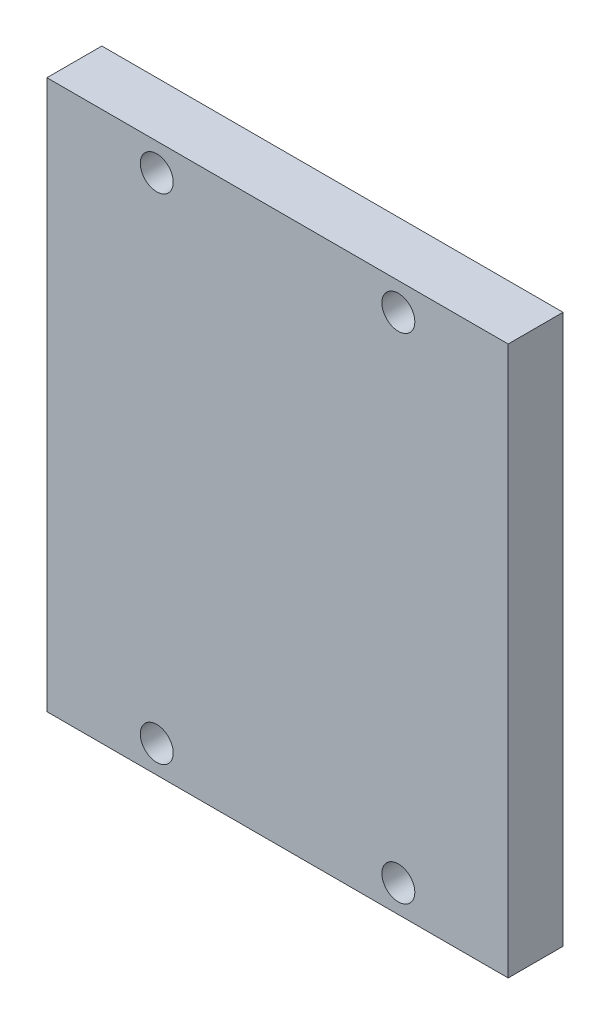
ISO-10303-21;
HEADER;
FILE_DESCRIPTION(('STEP AP214'),'2;1');
FILE_NAME('part.step','',(''),(''),'','','');
FILE_SCHEMA(('AUTOMOTIVE_DESIGN { 1 0 10303 214 1 1 1 1 }'));
ENDSEC;
DATA;
#1=APPLICATION_CONTEXT('core data for automotive mechanical design processes');
#2=APPLICATION_PROTOCOL_DEFINITION('international standard','automotive_design',2000,#1);
#3=PRODUCT_CONTEXT('',#1,'mechanical');
#4=PRODUCT('Part','Part','',(#3));
#5=PRODUCT_RELATED_PRODUCT_CATEGORY('part','',(#4));
#6=PRODUCT_DEFINITION_FORMATION('','',#4);
#7=PRODUCT_DEFINITION_CONTEXT('part definition',#1,'design');
#8=PRODUCT_DEFINITION('design','',#6,#7);
#9=PRODUCT_DEFINITION_SHAPE('','',#8);
#10=(LENGTH_UNIT() NAMED_UNIT(*) SI_UNIT(.MILLI.,.METRE.));
#11=(NAMED_UNIT(*) PLANE_ANGLE_UNIT() SI_UNIT($,.RADIAN.));
#12=(NAMED_UNIT(*) SI_UNIT($,.STERADIAN.) SOLID_ANGLE_UNIT());
#13=UNCERTAINTY_MEASURE_WITH_UNIT(LENGTH_MEASURE(1.E-05),#10,'distance_accuracy_value','');
#14=(GEOMETRIC_REPRESENTATION_CONTEXT(3) GLOBAL_UNCERTAINTY_ASSIGNED_CONTEXT((#13)) GLOBAL_UNIT_ASSIGNED_CONTEXT((#10,
#11,#12)) REPRESENTATION_CONTEXT('',''));
#15=CARTESIAN_POINT('',(0.,0.,0.));
#16=DIRECTION('',(0.,0.,1.));
#17=DIRECTION('',(1.,0.,0.));
#18=AXIS2_PLACEMENT_3D('',#15,#16,#17);
#19=CARTESIAN_POINT('',(0.,0.,5.));
#20=DIRECTION('',(0.,0.,-1.));
#21=DIRECTION('',(-1.,0.,0.));
#22=AXIS2_PLACEMENT_3D('',#19,#20,#21);
#23=PLANE('',#22);
#24=CARTESIAN_POINT('',(10.,2.5,5.));
#25=DIRECTION('',(0.,0.,1.));
#26=DIRECTION('',(1.,0.,0.));
#27=AXIS2_PLACEMENT_3D('',#24,#25,#26);
#28=CIRCLE('',#27,1.5);
#29=CARTESIAN_POINT('',(11.5,2.5,5.));
#30=VERTEX_POINT('',#29);
#31=EDGE_CURVE('E82',#30,#30,#28,.T.);
#32=ORIENTED_EDGE('',*,*,#31,.F.);
#33=EDGE_LOOP('',(#32));
#34=FACE_BOUND('',#33,.T.);
#35=DIRECTION('',(0.,-1.,0.));
#36=VECTOR('',#35,1.);
#37=CARTESIAN_POINT('',(0.,0.,5.));
#38=LINE('',#37,#36);
#39=CARTESIAN_POINT('',(0.,50.,5.));
#40=VERTEX_POINT('',#39);
#41=CARTESIAN_POINT('',(0.,0.,5.));
#42=VERTEX_POINT('',#41);
#43=EDGE_CURVE('E68',#40,#42,#38,.T.);
#44=ORIENTED_EDGE('',*,*,#43,.T.);
#45=DIRECTION('',(1.,0.,0.));
#46=VECTOR('',#45,1.);
#47=CARTESIAN_POINT('',(0.,0.,5.));
#48=LINE('',#47,#46);
#49=CARTESIAN_POINT('',(42.,0.,5.));
#50=VERTEX_POINT('',#49);
#51=EDGE_CURVE('E50',#42,#50,#48,.T.);
#52=ORIENTED_EDGE('',*,*,#51,.T.);
#53=DIRECTION('',(0.,1.,0.));
#54=VECTOR('',#53,1.);
#55=CARTESIAN_POINT('',(42.,0.,5.));
#56=LINE('',#55,#54);
#57=CARTESIAN_POINT('',(42.,50.,5.));
#58=VERTEX_POINT('',#57);
#59=EDGE_CURVE('E117',#50,#58,#56,.T.);
#60=ORIENTED_EDGE('',*,*,#59,.T.);
#61=DIRECTION('',(1.,0.,0.));
#62=VECTOR('',#61,1.);
#63=CARTESIAN_POINT('',(0.,50.,5.));
#64=LINE('',#63,#62);
#65=EDGE_CURVE('E89',#40,#58,#64,.T.);
#66=ORIENTED_EDGE('',*,*,#65,.F.);
#67=EDGE_LOOP('',(#44,#52,#60,#66));
#68=FACE_BOUND('',#67,.T.);
#69=CARTESIAN_POINT('',(32.,2.5,5.));
#70=DIRECTION('',(0.,0.,1.));
#71=DIRECTION('',(1.,0.,0.));
#72=AXIS2_PLACEMENT_3D('',#69,#70,#71);
#73=CIRCLE('',#72,1.5);
#74=CARTESIAN_POINT('',(33.5,2.5,5.));
#75=VERTEX_POINT('',#74);
#76=EDGE_CURVE('E104',#75,#75,#73,.T.);
#77=ORIENTED_EDGE('',*,*,#76,.F.);
#78=EDGE_LOOP('',(#77));
#79=FACE_BOUND('',#78,.T.);
#80=CARTESIAN_POINT('',(32.,47.5,5.));
#81=DIRECTION('',(0.,0.,-1.));
#82=DIRECTION('',(1.,0.,0.));
#83=AXIS2_PLACEMENT_3D('',#80,#81,#82);
#84=CIRCLE('',#83,1.5);
#85=CARTESIAN_POINT('',(33.5,47.5,5.));
#86=VERTEX_POINT('',#85);
#87=EDGE_CURVE('E135',#86,#86,#84,.T.);
#88=ORIENTED_EDGE('',*,*,#87,.T.);
#89=EDGE_LOOP('',(#88));
#90=FACE_BOUND('',#89,.T.);
#91=CARTESIAN_POINT('',(10.,47.5,5.));
#92=DIRECTION('',(0.,0.,-1.));
#93=DIRECTION('',(1.,0.,0.));
#94=AXIS2_PLACEMENT_3D('',#91,#92,#93);
#95=CIRCLE('',#94,1.5);
#96=CARTESIAN_POINT('',(11.5,47.5,5.));
#97=VERTEX_POINT('',#96);
#98=EDGE_CURVE('E94',#97,#97,#95,.T.);
#99=ORIENTED_EDGE('',*,*,#98,.T.);
#100=EDGE_LOOP('',(#99));
#101=FACE_BOUND('',#100,.T.);
#102=ADVANCED_FACE('F33',(#34,#68,#79,#90,#101),#23,.F.);
#103=CARTESIAN_POINT('',(0.,0.,0.));
#104=DIRECTION('',(0.,0.,-1.));
#105=DIRECTION('',(-1.,0.,0.));
#106=AXIS2_PLACEMENT_3D('',#103,#104,#105);
#107=PLANE('',#106);
#108=CARTESIAN_POINT('',(10.,2.5,0.));
#109=DIRECTION('',(0.,0.,1.));
#110=DIRECTION('',(1.,0.,0.));
#111=AXIS2_PLACEMENT_3D('',#108,#109,#110);
#112=CIRCLE('',#111,1.5);
#113=CARTESIAN_POINT('',(11.5,2.5,0.));
#114=VERTEX_POINT('',#113);
#115=EDGE_CURVE('E107',#114,#114,#112,.T.);
#116=ORIENTED_EDGE('',*,*,#115,.T.);
#117=EDGE_LOOP('',(#116));
#118=FACE_BOUND('',#117,.T.);
#119=DIRECTION('',(0.,-1.,0.));
#120=VECTOR('',#119,1.);
#121=CARTESIAN_POINT('',(0.,0.,0.));
#122=LINE('',#121,#120);
#123=CARTESIAN_POINT('',(0.,50.,0.));
#124=VERTEX_POINT('',#123);
#125=CARTESIAN_POINT('',(0.,0.,0.));
#126=VERTEX_POINT('',#125);
#127=EDGE_CURVE('E77',#124,#126,#122,.T.);
#128=ORIENTED_EDGE('',*,*,#127,.F.);
#129=DIRECTION('',(1.,0.,0.));
#130=VECTOR('',#129,1.);
#131=CARTESIAN_POINT('',(0.,50.,0.));
#132=LINE('',#131,#130);
#133=CARTESIAN_POINT('',(42.,50.,0.));
#134=VERTEX_POINT('',#133);
#135=EDGE_CURVE('E81',#124,#134,#132,.T.);
#136=ORIENTED_EDGE('',*,*,#135,.T.);
#137=DIRECTION('',(0.,1.,0.));
#138=VECTOR('',#137,1.);
#139=CARTESIAN_POINT('',(42.,0.,0.));
#140=LINE('',#139,#138);
#141=CARTESIAN_POINT('',(42.,0.,0.));
#142=VERTEX_POINT('',#141);
#143=EDGE_CURVE('E115',#142,#134,#140,.T.);
#144=ORIENTED_EDGE('',*,*,#143,.F.);
#145=DIRECTION('',(1.,0.,0.));
#146=VECTOR('',#145,1.);
#147=CARTESIAN_POINT('',(0.,0.,0.));
#148=LINE('',#147,#146);
#149=EDGE_CURVE('E61',#126,#142,#148,.T.);
#150=ORIENTED_EDGE('',*,*,#149,.F.);
#151=EDGE_LOOP('',(#128,#136,#144,#150));
#152=FACE_BOUND('',#151,.T.);
#153=CARTESIAN_POINT('',(32.,2.5,0.));
#154=DIRECTION('',(0.,0.,1.));
#155=DIRECTION('',(1.,0.,0.));
#156=AXIS2_PLACEMENT_3D('',#153,#154,#155);
#157=CIRCLE('',#156,1.5);
#158=CARTESIAN_POINT('',(33.5,2.5,0.));
#159=VERTEX_POINT('',#158);
#160=EDGE_CURVE('E103',#159,#159,#157,.T.);
#161=ORIENTED_EDGE('',*,*,#160,.T.);
#162=EDGE_LOOP('',(#161));
#163=FACE_BOUND('',#162,.T.);
#164=CARTESIAN_POINT('',(32.,47.5,0.));
#165=DIRECTION('',(0.,0.,-1.));
#166=DIRECTION('',(1.,0.,0.));
#167=AXIS2_PLACEMENT_3D('',#164,#165,#166);
#168=CIRCLE('',#167,1.5);
#169=CARTESIAN_POINT('',(33.5,47.5,0.));
#170=VERTEX_POINT('',#169);
#171=EDGE_CURVE('E146',#170,#170,#168,.T.);
#172=ORIENTED_EDGE('',*,*,#171,.F.);
#173=EDGE_LOOP('',(#172));
#174=FACE_BOUND('',#173,.T.);
#175=CARTESIAN_POINT('',(10.,47.5,0.));
#176=DIRECTION('',(0.,0.,-1.));
#177=DIRECTION('',(1.,0.,0.));
#178=AXIS2_PLACEMENT_3D('',#175,#176,#177);
#179=CIRCLE('',#178,1.5);
#180=CARTESIAN_POINT('',(11.5,47.5,0.));
#181=VERTEX_POINT('',#180);
#182=EDGE_CURVE('E98',#181,#181,#179,.T.);
#183=ORIENTED_EDGE('',*,*,#182,.F.);
#184=EDGE_LOOP('',(#183));
#185=FACE_BOUND('',#184,.T.);
#186=ADVANCED_FACE('F78',(#118,#152,#163,#174,#185),#107,.T.);
#187=CARTESIAN_POINT('',(0.,0.,5.));
#188=DIRECTION('',(1.,0.,0.));
#189=DIRECTION('',(0.,0.,-1.));
#190=AXIS2_PLACEMENT_3D('',#187,#188,#189);
#191=PLANE('',#190);
#192=ORIENTED_EDGE('',*,*,#127,.T.);
#193=DIRECTION('',(0.,0.,-1.));
#194=VECTOR('',#193,1.);
#195=CARTESIAN_POINT('',(0.,0.,5.));
#196=LINE('',#195,#194);
#197=EDGE_CURVE('E11',#42,#126,#196,.T.);
#198=ORIENTED_EDGE('',*,*,#197,.F.);
#199=ORIENTED_EDGE('',*,*,#43,.F.);
#200=DIRECTION('',(0.,0.,-1.));
#201=VECTOR('',#200,1.);
#202=CARTESIAN_POINT('',(0.,50.,5.));
#203=LINE('',#202,#201);
#204=EDGE_CURVE('E84',#40,#124,#203,.T.);
#205=ORIENTED_EDGE('',*,*,#204,.T.);
#206=EDGE_LOOP('',(#192,#198,#199,#205));
#207=FACE_BOUND('',#206,.T.);
#208=ADVANCED_FACE('F35',(#207),#191,.F.);
#209=CARTESIAN_POINT('',(0.,0.,5.));
#210=DIRECTION('',(0.,1.,0.));
#211=DIRECTION('',(0.,0.,1.));
#212=AXIS2_PLACEMENT_3D('',#209,#210,#211);
#213=PLANE('',#212);
#214=ORIENTED_EDGE('',*,*,#149,.T.);
#215=DIRECTION('',(0.,0.,-1.));
#216=VECTOR('',#215,1.);
#217=CARTESIAN_POINT('',(42.,0.,5.));
#218=LINE('',#217,#216);
#219=EDGE_CURVE('E42',#50,#142,#218,.T.);
#220=ORIENTED_EDGE('',*,*,#219,.F.);
#221=ORIENTED_EDGE('',*,*,#51,.F.);
#222=ORIENTED_EDGE('',*,*,#197,.T.);
#223=EDGE_LOOP('',(#214,#220,#221,#222));
#224=FACE_BOUND('',#223,.T.);
#225=ADVANCED_FACE('F125',(#224),#213,.F.);
#226=CARTESIAN_POINT('',(42.,0.,5.));
#227=DIRECTION('',(-1.,0.,0.));
#228=DIRECTION('',(0.,0.,1.));
#229=AXIS2_PLACEMENT_3D('',#226,#227,#228);
#230=PLANE('',#229);
#231=ORIENTED_EDGE('',*,*,#143,.T.);
#232=DIRECTION('',(0.,0.,-1.));
#233=VECTOR('',#232,1.);
#234=CARTESIAN_POINT('',(42.,50.,5.));
#235=LINE('',#234,#233);
#236=EDGE_CURVE('E88',#58,#134,#235,.T.);
#237=ORIENTED_EDGE('',*,*,#236,.F.);
#238=ORIENTED_EDGE('',*,*,#59,.F.);
#239=ORIENTED_EDGE('',*,*,#219,.T.);
#240=EDGE_LOOP('',(#231,#237,#238,#239));
#241=FACE_BOUND('',#240,.T.);
#242=ADVANCED_FACE('F123',(#241),#230,.F.);
#243=CARTESIAN_POINT('',(10.,2.5,5.));
#244=DIRECTION('',(0.,0.,-1.));
#245=DIRECTION('',(-1.,0.,0.));
#246=AXIS2_PLACEMENT_3D('',#243,#244,#245);
#247=CYLINDRICAL_SURFACE('',#246,1.5);
#248=ORIENTED_EDGE('',*,*,#31,.T.);
#249=EDGE_LOOP('',(#248));
#250=FACE_BOUND('',#249,.T.);
#251=ORIENTED_EDGE('',*,*,#115,.F.);
#252=EDGE_LOOP('',(#251));
#253=FACE_BOUND('',#252,.T.);
#254=ADVANCED_FACE('F162',(#250,#253),#247,.F.);
#255=CARTESIAN_POINT('',(32.,2.5,5.));
#256=DIRECTION('',(0.,0.,-1.));
#257=DIRECTION('',(-1.,0.,0.));
#258=AXIS2_PLACEMENT_3D('',#255,#256,#257);
#259=CYLINDRICAL_SURFACE('',#258,1.5);
#260=ORIENTED_EDGE('',*,*,#76,.T.);
#261=EDGE_LOOP('',(#260));
#262=FACE_BOUND('',#261,.T.);
#263=ORIENTED_EDGE('',*,*,#160,.F.);
#264=EDGE_LOOP('',(#263));
#265=FACE_BOUND('',#264,.T.);
#266=ADVANCED_FACE('F179',(#262,#265),#259,.F.);
#267=CARTESIAN_POINT('',(0.,50.,5.));
#268=DIRECTION('',(0.,1.,0.));
#269=DIRECTION('',(0.,0.,1.));
#270=AXIS2_PLACEMENT_3D('',#267,#268,#269);
#271=PLANE('',#270);
#272=ORIENTED_EDGE('',*,*,#135,.F.);
#273=ORIENTED_EDGE('',*,*,#204,.F.);
#274=ORIENTED_EDGE('',*,*,#65,.T.);
#275=ORIENTED_EDGE('',*,*,#236,.T.);
#276=EDGE_LOOP('',(#272,#273,#274,#275));
#277=FACE_BOUND('',#276,.T.);
#278=ADVANCED_FACE('F92',(#277),#271,.T.);
#279=CARTESIAN_POINT('',(10.,47.5,5.));
#280=DIRECTION('',(0.,0.,-1.));
#281=DIRECTION('',(-1.,0.,0.));
#282=AXIS2_PLACEMENT_3D('',#279,#280,#281);
#283=CYLINDRICAL_SURFACE('',#282,1.5);
#284=ORIENTED_EDGE('',*,*,#98,.F.);
#285=EDGE_LOOP('',(#284));
#286=FACE_BOUND('',#285,.T.);
#287=ORIENTED_EDGE('',*,*,#182,.T.);
#288=EDGE_LOOP('',(#287));
#289=FACE_BOUND('',#288,.T.);
#290=ADVANCED_FACE('F138',(#286,#289),#283,.F.);
#291=CARTESIAN_POINT('',(32.,47.5,5.));
#292=DIRECTION('',(0.,0.,-1.));
#293=DIRECTION('',(-1.,0.,0.));
#294=AXIS2_PLACEMENT_3D('',#291,#292,#293);
#295=CYLINDRICAL_SURFACE('',#294,1.5);
#296=ORIENTED_EDGE('',*,*,#87,.F.);
#297=EDGE_LOOP('',(#296));
#298=FACE_BOUND('',#297,.T.);
#299=ORIENTED_EDGE('',*,*,#171,.T.);
#300=EDGE_LOOP('',(#299));
#301=FACE_BOUND('',#300,.T.);
#302=ADVANCED_FACE('F141',(#298,#301),#295,.F.);
#303=CLOSED_SHELL('',(#102,#186,#208,#225,#242,#254,#266,#278,#290,#302));
#304=MANIFOLD_SOLID_BREP('B2',#303);
#305=ADVANCED_BREP_SHAPE_REPRESENTATION('',(#18,#304),#14);
#306=SHAPE_DEFINITION_REPRESENTATION(#9,#305);
ENDSEC;
END-ISO-10303-21;
